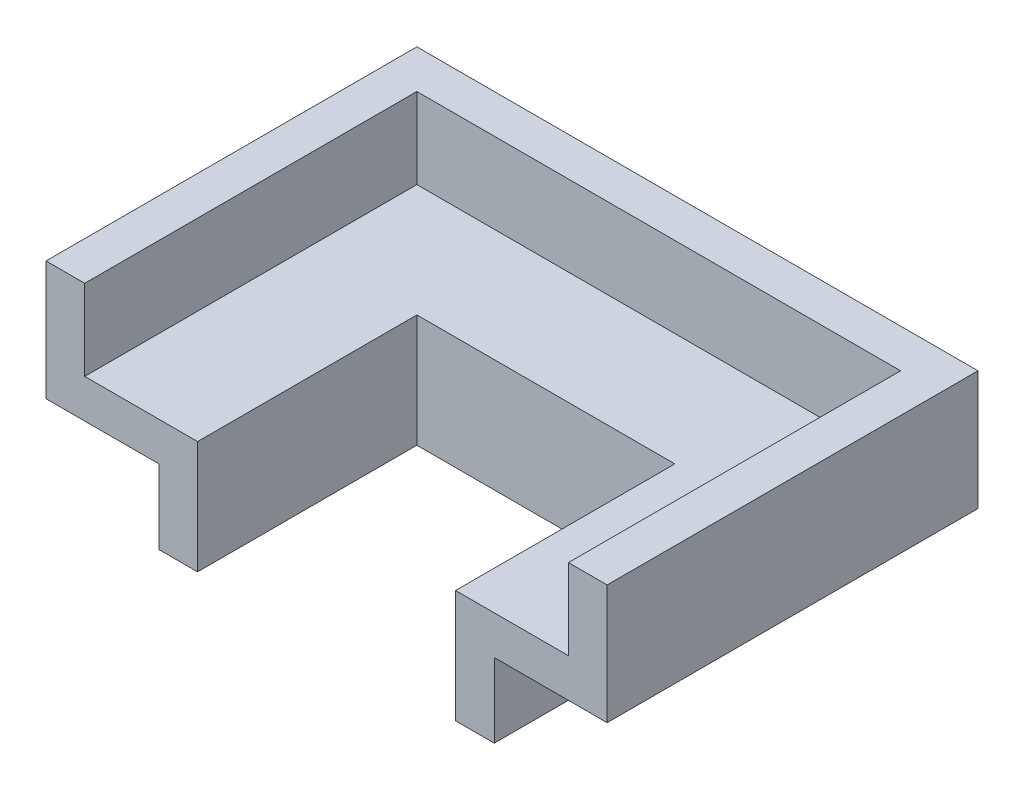
ISO-10303-21;
HEADER;
FILE_DESCRIPTION(('STEP AP214'),'2;1');
FILE_NAME('part.step','',(''),(''),'','','');
FILE_SCHEMA(('AUTOMOTIVE_DESIGN { 1 0 10303 214 1 1 1 1 }'));
ENDSEC;
DATA;
#1=APPLICATION_CONTEXT('core data for automotive mechanical design processes');
#2=APPLICATION_PROTOCOL_DEFINITION('international standard','automotive_design',2000,#1);
#3=PRODUCT_CONTEXT('',#1,'mechanical');
#4=PRODUCT('Part','Part','',(#3));
#5=PRODUCT_RELATED_PRODUCT_CATEGORY('part','',(#4));
#6=PRODUCT_DEFINITION_FORMATION('','',#4);
#7=PRODUCT_DEFINITION_CONTEXT('part definition',#1,'design');
#8=PRODUCT_DEFINITION('design','',#6,#7);
#9=PRODUCT_DEFINITION_SHAPE('','',#8);
#10=(LENGTH_UNIT() NAMED_UNIT(*) SI_UNIT(.MILLI.,.METRE.));
#11=(NAMED_UNIT(*) PLANE_ANGLE_UNIT() SI_UNIT($,.RADIAN.));
#12=(NAMED_UNIT(*) SI_UNIT($,.STERADIAN.) SOLID_ANGLE_UNIT());
#13=UNCERTAINTY_MEASURE_WITH_UNIT(LENGTH_MEASURE(1.E-05),#10,'distance_accuracy_value','');
#14=(GEOMETRIC_REPRESENTATION_CONTEXT(3) GLOBAL_UNCERTAINTY_ASSIGNED_CONTEXT((#13)) GLOBAL_UNIT_ASSIGNED_CONTEXT((#10,
#11,#12)) REPRESENTATION_CONTEXT('',''));
#15=CARTESIAN_POINT('',(0.,0.,0.));
#16=DIRECTION('',(0.,0.,1.));
#17=DIRECTION('',(1.,0.,0.));
#18=AXIS2_PLACEMENT_3D('',#15,#16,#17);
#19=CARTESIAN_POINT('',(-40.,0.,-68.));
#20=DIRECTION('',(1.,0.,0.));
#21=DIRECTION('',(0.,0.,-1.));
#22=AXIS2_PLACEMENT_3D('',#19,#20,#21);
#23=PLANE('',#22);
#24=DIRECTION('',(0.,0.,1.));
#25=VECTOR('',#24,1.);
#26=CARTESIAN_POINT('',(-40.,35.,-68.));
#27=LINE('',#26,#25);
#28=CARTESIAN_POINT('',(-40.,35.,-68.));
#29=VERTEX_POINT('',#28);
#30=CARTESIAN_POINT('',(-40.,35.,0.));
#31=VERTEX_POINT('',#30);
#32=EDGE_CURVE('E229',#29,#31,#27,.T.);
#33=ORIENTED_EDGE('',*,*,#32,.T.);
#34=DIRECTION('',(0.,-1.,0.));
#35=VECTOR('',#34,1.);
#36=CARTESIAN_POINT('',(-40.,0.,0.));
#37=LINE('',#36,#35);
#38=CARTESIAN_POINT('',(-39.9999999999999,0.,0.));
#39=VERTEX_POINT('',#38);
#40=EDGE_CURVE('E255',#31,#39,#37,.T.);
#41=ORIENTED_EDGE('',*,*,#40,.T.);
#42=DIRECTION('',(0.,0.,1.));
#43=VECTOR('',#42,1.);
#44=CARTESIAN_POINT('',(-40.,0.,-68.));
#45=LINE('',#44,#43);
#46=CARTESIAN_POINT('',(-40.,0.,-68.));
#47=VERTEX_POINT('',#46);
#48=EDGE_CURVE('E233',#47,#39,#45,.T.);
#49=ORIENTED_EDGE('',*,*,#48,.F.);
#50=DIRECTION('',(0.,1.,0.));
#51=VECTOR('',#50,1.);
#52=CARTESIAN_POINT('',(-40.,0.,-68.));
#53=LINE('',#52,#51);
#54=EDGE_CURVE('E230',#47,#29,#53,.T.);
#55=ORIENTED_EDGE('',*,*,#54,.T.);
#56=EDGE_LOOP('',(#33,#41,#49,#55));
#57=FACE_BOUND('',#56,.T.);
#58=ADVANCED_FACE('F34',(#57),#23,.T.);
#59=CARTESIAN_POINT('',(-52.,0.,-80.));
#60=DIRECTION('',(-1.,0.,0.));
#61=DIRECTION('',(0.,0.,1.));
#62=AXIS2_PLACEMENT_3D('',#59,#60,#61);
#63=PLANE('',#62);
#64=DIRECTION('',(0.,0.,1.));
#65=VECTOR('',#64,1.);
#66=CARTESIAN_POINT('',(-52.,0.,-80.));
#67=LINE('',#66,#65);
#68=CARTESIAN_POINT('',(-52.,0.,-80.));
#69=VERTEX_POINT('',#68);
#70=CARTESIAN_POINT('',(-52.,0.,0.));
#71=VERTEX_POINT('',#70);
#72=EDGE_CURVE('E236',#69,#71,#67,.T.);
#73=ORIENTED_EDGE('',*,*,#72,.T.);
#74=DIRECTION('',(0.,1.,0.));
#75=VECTOR('',#74,1.);
#76=CARTESIAN_POINT('',(-52.,0.,0.));
#77=LINE('',#76,#75);
#78=CARTESIAN_POINT('',(-52.,23.,0.));
#79=VERTEX_POINT('',#78);
#80=EDGE_CURVE('E289',#71,#79,#77,.T.);
#81=ORIENTED_EDGE('',*,*,#80,.T.);
#82=DIRECTION('',(0.,0.,1.));
#83=VECTOR('',#82,1.);
#84=CARTESIAN_POINT('',(-52.,23.,-80.));
#85=LINE('',#84,#83);
#86=CARTESIAN_POINT('',(-52.,23.,-80.));
#87=VERTEX_POINT('',#86);
#88=EDGE_CURVE('E239',#87,#79,#85,.T.);
#89=ORIENTED_EDGE('',*,*,#88,.F.);
#90=DIRECTION('',(0.,-1.,0.));
#91=VECTOR('',#90,1.);
#92=CARTESIAN_POINT('',(-52.,0.,-80.));
#93=LINE('',#92,#91);
#94=EDGE_CURVE('E264',#87,#69,#93,.T.);
#95=ORIENTED_EDGE('',*,*,#94,.T.);
#96=EDGE_LOOP('',(#73,#81,#89,#95));
#97=FACE_BOUND('',#96,.T.);
#98=ADVANCED_FACE('F303',(#97),#63,.T.);
#99=CARTESIAN_POINT('',(-87.,23.,-115.));
#100=DIRECTION('',(-1.,0.,0.));
#101=DIRECTION('',(0.,0.,1.));
#102=AXIS2_PLACEMENT_3D('',#99,#100,#101);
#103=PLANE('',#102);
#104=DIRECTION('',(0.,0.,1.));
#105=VECTOR('',#104,1.);
#106=CARTESIAN_POINT('',(-87.,23.,-115.));
#107=LINE('',#106,#105);
#108=CARTESIAN_POINT('',(-87.,23.,-115.));
#109=VERTEX_POINT('',#108);
#110=CARTESIAN_POINT('',(-87.,23.,0.));
#111=VERTEX_POINT('',#110);
#112=EDGE_CURVE('E242',#109,#111,#107,.T.);
#113=ORIENTED_EDGE('',*,*,#112,.T.);
#114=DIRECTION('',(0.,1.,0.));
#115=VECTOR('',#114,1.);
#116=CARTESIAN_POINT('',(-87.,23.,0.));
#117=LINE('',#116,#115);
#118=CARTESIAN_POINT('',(-87.0000000000001,60.,0.));
#119=VERTEX_POINT('',#118);
#120=EDGE_CURVE('E43',#111,#119,#117,.T.);
#121=ORIENTED_EDGE('',*,*,#120,.T.);
#122=DIRECTION('',(0.,0.,1.));
#123=VECTOR('',#122,1.);
#124=CARTESIAN_POINT('',(-87.0000000000001,60.,-115.));
#125=LINE('',#124,#123);
#126=CARTESIAN_POINT('',(-87.0000000000001,60.,-115.));
#127=VERTEX_POINT('',#126);
#128=EDGE_CURVE('E245',#127,#119,#125,.T.);
#129=ORIENTED_EDGE('',*,*,#128,.F.);
#130=DIRECTION('',(0.,-1.,0.));
#131=VECTOR('',#130,1.);
#132=CARTESIAN_POINT('',(-87.,23.,-115.));
#133=LINE('',#132,#131);
#134=EDGE_CURVE('E225',#127,#109,#133,.T.);
#135=ORIENTED_EDGE('',*,*,#134,.T.);
#136=EDGE_LOOP('',(#113,#121,#129,#135));
#137=FACE_BOUND('',#136,.T.);
#138=ADVANCED_FACE('F297',(#137),#103,.T.);
#139=CARTESIAN_POINT('',(-75.,35.,-103.));
#140=DIRECTION('',(1.,0.,0.));
#141=DIRECTION('',(0.,0.,-1.));
#142=AXIS2_PLACEMENT_3D('',#139,#140,#141);
#143=PLANE('',#142);
#144=DIRECTION('',(0.,0.,1.));
#145=VECTOR('',#144,1.);
#146=CARTESIAN_POINT('',(-75.,60.,-103.));
#147=LINE('',#146,#145);
#148=CARTESIAN_POINT('',(-75.,60.,-103.));
#149=VERTEX_POINT('',#148);
#150=CARTESIAN_POINT('',(-75.,60.,0.));
#151=VERTEX_POINT('',#150);
#152=EDGE_CURVE('E247',#149,#151,#147,.T.);
#153=ORIENTED_EDGE('',*,*,#152,.T.);
#154=DIRECTION('',(0.,-1.,0.));
#155=VECTOR('',#154,1.);
#156=CARTESIAN_POINT('',(-75.,35.,0.));
#157=LINE('',#156,#155);
#158=CARTESIAN_POINT('',(-75.,35.,0.));
#159=VERTEX_POINT('',#158);
#160=EDGE_CURVE('E38',#151,#159,#157,.T.);
#161=ORIENTED_EDGE('',*,*,#160,.T.);
#162=DIRECTION('',(0.,0.,1.));
#163=VECTOR('',#162,1.);
#164=CARTESIAN_POINT('',(-75.,35.,-103.));
#165=LINE('',#164,#163);
#166=CARTESIAN_POINT('',(-75.,35.,-103.));
#167=VERTEX_POINT('',#166);
#168=EDGE_CURVE('E249',#167,#159,#165,.T.);
#169=ORIENTED_EDGE('',*,*,#168,.F.);
#170=DIRECTION('',(0.,1.,0.));
#171=VECTOR('',#170,1.);
#172=CARTESIAN_POINT('',(-75.,35.,-103.));
#173=LINE('',#172,#171);
#174=EDGE_CURVE('E226',#167,#149,#173,.T.);
#175=ORIENTED_EDGE('',*,*,#174,.T.);
#176=EDGE_LOOP('',(#153,#161,#169,#175));
#177=FACE_BOUND('',#176,.T.);
#178=ADVANCED_FACE('F36',(#177),#143,.T.);
#179=CARTESIAN_POINT('',(40.,0.,-68.));
#180=DIRECTION('',(0.,0.,-1.));
#181=DIRECTION('',(-1.,0.,0.));
#182=AXIS2_PLACEMENT_3D('',#179,#180,#181);
#183=PLANE('',#182);
#184=ORIENTED_EDGE('',*,*,#54,.F.);
#185=DIRECTION('',(-1.,0.,0.));
#186=VECTOR('',#185,1.);
#187=CARTESIAN_POINT('',(40.,0.,-68.));
#188=LINE('',#187,#186);
#189=CARTESIAN_POINT('',(40.,0.,-68.));
#190=VERTEX_POINT('',#189);
#191=EDGE_CURVE('E206',#190,#47,#188,.T.);
#192=ORIENTED_EDGE('',*,*,#191,.F.);
#193=DIRECTION('',(0.,-1.,0.));
#194=VECTOR('',#193,1.);
#195=CARTESIAN_POINT('',(40.,0.,-68.));
#196=LINE('',#195,#194);
#197=CARTESIAN_POINT('',(40.,35.,-68.));
#198=VERTEX_POINT('',#197);
#199=EDGE_CURVE('E173',#198,#190,#196,.T.);
#200=ORIENTED_EDGE('',*,*,#199,.F.);
#201=DIRECTION('',(-1.,0.,0.));
#202=VECTOR('',#201,1.);
#203=CARTESIAN_POINT('',(40.,35.,-68.));
#204=LINE('',#203,#202);
#205=EDGE_CURVE('E203',#198,#29,#204,.T.);
#206=ORIENTED_EDGE('',*,*,#205,.T.);
#207=EDGE_LOOP('',(#184,#192,#200,#206));
#208=FACE_BOUND('',#207,.T.);
#209=ADVANCED_FACE('F285',(#208),#183,.F.);
#210=CARTESIAN_POINT('',(52.,0.,-80.));
#211=DIRECTION('',(0.,0.,1.));
#212=DIRECTION('',(1.,0.,0.));
#213=AXIS2_PLACEMENT_3D('',#210,#211,#212);
#214=PLANE('',#213);
#215=ORIENTED_EDGE('',*,*,#94,.F.);
#216=DIRECTION('',(-1.,0.,0.));
#217=VECTOR('',#216,1.);
#218=CARTESIAN_POINT('',(52.,23.,-80.));
#219=LINE('',#218,#217);
#220=CARTESIAN_POINT('',(52.,23.,-80.));
#221=VERTEX_POINT('',#220);
#222=EDGE_CURVE('E210',#221,#87,#219,.T.);
#223=ORIENTED_EDGE('',*,*,#222,.F.);
#224=DIRECTION('',(0.,1.,0.));
#225=VECTOR('',#224,1.);
#226=CARTESIAN_POINT('',(52.,0.,-80.));
#227=LINE('',#226,#225);
#228=CARTESIAN_POINT('',(52.,0.,-80.));
#229=VERTEX_POINT('',#228);
#230=EDGE_CURVE('E191',#229,#221,#227,.T.);
#231=ORIENTED_EDGE('',*,*,#230,.F.);
#232=DIRECTION('',(-1.,0.,0.));
#233=VECTOR('',#232,1.);
#234=CARTESIAN_POINT('',(52.,0.,-80.));
#235=LINE('',#234,#233);
#236=EDGE_CURVE('E152',#229,#69,#235,.T.);
#237=ORIENTED_EDGE('',*,*,#236,.T.);
#238=EDGE_LOOP('',(#215,#223,#231,#237));
#239=FACE_BOUND('',#238,.T.);
#240=ADVANCED_FACE('F305',(#239),#214,.F.);
#241=CARTESIAN_POINT('',(87.,23.,-115.));
#242=DIRECTION('',(0.,0.,1.));
#243=DIRECTION('',(1.,0.,0.));
#244=AXIS2_PLACEMENT_3D('',#241,#242,#243);
#245=PLANE('',#244);
#246=ORIENTED_EDGE('',*,*,#134,.F.);
#247=DIRECTION('',(-1.,0.,0.));
#248=VECTOR('',#247,1.);
#249=CARTESIAN_POINT('',(87.,60.,-115.));
#250=LINE('',#249,#248);
#251=CARTESIAN_POINT('',(87.,60.,-115.));
#252=VERTEX_POINT('',#251);
#253=EDGE_CURVE('E216',#252,#127,#250,.T.);
#254=ORIENTED_EDGE('',*,*,#253,.F.);
#255=DIRECTION('',(0.,1.,0.));
#256=VECTOR('',#255,1.);
#257=CARTESIAN_POINT('',(87.,23.,-115.));
#258=LINE('',#257,#256);
#259=CARTESIAN_POINT('',(87.,23.,-115.));
#260=VERTEX_POINT('',#259);
#261=EDGE_CURVE('E270',#260,#252,#258,.T.);
#262=ORIENTED_EDGE('',*,*,#261,.F.);
#263=DIRECTION('',(-1.,0.,0.));
#264=VECTOR('',#263,1.);
#265=CARTESIAN_POINT('',(87.,23.,-115.));
#266=LINE('',#265,#264);
#267=EDGE_CURVE('E213',#260,#109,#266,.T.);
#268=ORIENTED_EDGE('',*,*,#267,.T.);
#269=EDGE_LOOP('',(#246,#254,#262,#268));
#270=FACE_BOUND('',#269,.T.);
#271=ADVANCED_FACE('F324',(#270),#245,.F.);
#272=CARTESIAN_POINT('',(75.,35.,-103.));
#273=DIRECTION('',(0.,0.,-1.));
#274=DIRECTION('',(-1.,0.,0.));
#275=AXIS2_PLACEMENT_3D('',#272,#273,#274);
#276=PLANE('',#275);
#277=ORIENTED_EDGE('',*,*,#174,.F.);
#278=DIRECTION('',(-1.,0.,0.));
#279=VECTOR('',#278,1.);
#280=CARTESIAN_POINT('',(75.,35.,-103.));
#281=LINE('',#280,#279);
#282=CARTESIAN_POINT('',(75.,35.,-103.));
#283=VERTEX_POINT('',#282);
#284=EDGE_CURVE('E222',#283,#167,#281,.T.);
#285=ORIENTED_EDGE('',*,*,#284,.F.);
#286=DIRECTION('',(0.,-1.,0.));
#287=VECTOR('',#286,1.);
#288=CARTESIAN_POINT('',(75.,35.,-103.));
#289=LINE('',#288,#287);
#290=CARTESIAN_POINT('',(75.,60.,-103.));
#291=VERTEX_POINT('',#290);
#292=EDGE_CURVE('E272',#291,#283,#289,.T.);
#293=ORIENTED_EDGE('',*,*,#292,.F.);
#294=DIRECTION('',(-1.,0.,0.));
#295=VECTOR('',#294,1.);
#296=CARTESIAN_POINT('',(75.,60.,-103.));
#297=LINE('',#296,#295);
#298=EDGE_CURVE('E219',#291,#149,#297,.T.);
#299=ORIENTED_EDGE('',*,*,#298,.T.);
#300=EDGE_LOOP('',(#277,#285,#293,#299));
#301=FACE_BOUND('',#300,.T.);
#302=ADVANCED_FACE('F322',(#301),#276,.F.);
#303=CARTESIAN_POINT('',(0.,0.,0.));
#304=DIRECTION('',(0.,0.,1.));
#305=DIRECTION('',(1.,0.,0.));
#306=AXIS2_PLACEMENT_3D('',#303,#304,#305);
#307=PLANE('',#306);
#308=DIRECTION('',(1.,0.,0.));
#309=VECTOR('',#308,1.);
#310=CARTESIAN_POINT('',(40.,0.,0.));
#311=LINE('',#310,#309);
#312=CARTESIAN_POINT('',(40.,0.,0.));
#313=VERTEX_POINT('',#312);
#314=CARTESIAN_POINT('',(52.,0.,0.));
#315=VERTEX_POINT('',#314);
#316=EDGE_CURVE('E149',#313,#315,#311,.T.);
#317=ORIENTED_EDGE('',*,*,#316,.T.);
#318=DIRECTION('',(0.,1.,0.));
#319=VECTOR('',#318,1.);
#320=CARTESIAN_POINT('',(52.,0.,0.));
#321=LINE('',#320,#319);
#322=CARTESIAN_POINT('',(52.,23.,0.));
#323=VERTEX_POINT('',#322);
#324=EDGE_CURVE('E160',#315,#323,#321,.T.);
#325=ORIENTED_EDGE('',*,*,#324,.T.);
#326=DIRECTION('',(1.,0.,0.));
#327=VECTOR('',#326,1.);
#328=CARTESIAN_POINT('',(52.,23.,0.));
#329=LINE('',#328,#327);
#330=CARTESIAN_POINT('',(87.,23.,0.));
#331=VERTEX_POINT('',#330);
#332=EDGE_CURVE('E166',#323,#331,#329,.T.);
#333=ORIENTED_EDGE('',*,*,#332,.T.);
#334=DIRECTION('',(0.,1.,0.));
#335=VECTOR('',#334,1.);
#336=CARTESIAN_POINT('',(87.,23.,0.));
#337=LINE('',#336,#335);
#338=CARTESIAN_POINT('',(87.,60.,0.));
#339=VERTEX_POINT('',#338);
#340=EDGE_CURVE('E177',#331,#339,#337,.T.);
#341=ORIENTED_EDGE('',*,*,#340,.T.);
#342=DIRECTION('',(-1.,0.,0.));
#343=VECTOR('',#342,1.);
#344=CARTESIAN_POINT('',(75.,60.,0.));
#345=LINE('',#344,#343);
#346=CARTESIAN_POINT('',(75.,60.,0.));
#347=VERTEX_POINT('',#346);
#348=EDGE_CURVE('E180',#339,#347,#345,.T.);
#349=ORIENTED_EDGE('',*,*,#348,.T.);
#350=DIRECTION('',(0.,-1.,0.));
#351=VECTOR('',#350,1.);
#352=CARTESIAN_POINT('',(75.,35.,0.));
#353=LINE('',#352,#351);
#354=CARTESIAN_POINT('',(75.,35.,0.));
#355=VERTEX_POINT('',#354);
#356=EDGE_CURVE('E183',#347,#355,#353,.T.);
#357=ORIENTED_EDGE('',*,*,#356,.T.);
#358=DIRECTION('',(-1.,0.,0.));
#359=VECTOR('',#358,1.);
#360=CARTESIAN_POINT('',(40.,35.,0.));
#361=LINE('',#360,#359);
#362=CARTESIAN_POINT('',(40.,35.,0.));
#363=VERTEX_POINT('',#362);
#364=EDGE_CURVE('E186',#355,#363,#361,.T.);
#365=ORIENTED_EDGE('',*,*,#364,.T.);
#366=DIRECTION('',(0.,-1.,0.));
#367=VECTOR('',#366,1.);
#368=CARTESIAN_POINT('',(40.,0.,0.));
#369=LINE('',#368,#367);
#370=EDGE_CURVE('E157',#363,#313,#369,.T.);
#371=ORIENTED_EDGE('',*,*,#370,.T.);
#372=EDGE_LOOP('',(#317,#325,#333,#341,#349,#357,#365,#371));
#373=FACE_BOUND('',#372,.T.);
#374=ADVANCED_FACE('F168',(#373),#307,.T.);
#375=CARTESIAN_POINT('',(40.,0.,-167.716796049165));
#376=DIRECTION('',(0.,-1.,0.));
#377=DIRECTION('',(0.,0.,-1.));
#378=AXIS2_PLACEMENT_3D('',#375,#376,#377);
#379=PLANE('',#378);
#380=DIRECTION('',(0.,0.,1.));
#381=VECTOR('',#380,1.);
#382=CARTESIAN_POINT('',(40.,0.,-167.716796049165));
#383=LINE('',#382,#381);
#384=EDGE_CURVE('E189',#190,#313,#383,.T.);
#385=ORIENTED_EDGE('',*,*,#384,.F.);
#386=ORIENTED_EDGE('',*,*,#191,.T.);
#387=ORIENTED_EDGE('',*,*,#48,.T.);
#388=DIRECTION('',(-1.,0.,0.));
#389=VECTOR('',#388,1.);
#390=CARTESIAN_POINT('',(0.,0.,0.));
#391=LINE('',#390,#389);
#392=EDGE_CURVE('E258',#39,#71,#391,.T.);
#393=ORIENTED_EDGE('',*,*,#392,.T.);
#394=ORIENTED_EDGE('',*,*,#72,.F.);
#395=ORIENTED_EDGE('',*,*,#236,.F.);
#396=DIRECTION('',(0.,0.,1.));
#397=VECTOR('',#396,1.);
#398=CARTESIAN_POINT('',(52.,0.,-167.716796049165));
#399=LINE('',#398,#397);
#400=EDGE_CURVE('E144',#229,#315,#399,.T.);
#401=ORIENTED_EDGE('',*,*,#400,.T.);
#402=ORIENTED_EDGE('',*,*,#316,.F.);
#403=EDGE_LOOP('',(#385,#386,#387,#393,#394,#395,#401,#402));
#404=FACE_BOUND('',#403,.T.);
#405=ADVANCED_FACE('F147',(#404),#379,.T.);
#406=CARTESIAN_POINT('',(52.,0.,-167.716796049165));
#407=DIRECTION('',(1.,0.,0.));
#408=DIRECTION('',(0.,0.,-1.));
#409=AXIS2_PLACEMENT_3D('',#406,#407,#408);
#410=PLANE('',#409);
#411=ORIENTED_EDGE('',*,*,#400,.F.);
#412=ORIENTED_EDGE('',*,*,#230,.T.);
#413=DIRECTION('',(0.,0.,1.));
#414=VECTOR('',#413,1.);
#415=CARTESIAN_POINT('',(52.,23.,-167.716796049165));
#416=LINE('',#415,#414);
#417=EDGE_CURVE('E156',#221,#323,#416,.T.);
#418=ORIENTED_EDGE('',*,*,#417,.T.);
#419=ORIENTED_EDGE('',*,*,#324,.F.);
#420=EDGE_LOOP('',(#411,#412,#418,#419));
#421=FACE_BOUND('',#420,.T.);
#422=ADVANCED_FACE('F161',(#421),#410,.T.);
#423=CARTESIAN_POINT('',(52.,23.,-167.716796049165));
#424=DIRECTION('',(0.,-1.,0.));
#425=DIRECTION('',(0.,0.,-1.));
#426=AXIS2_PLACEMENT_3D('',#423,#424,#425);
#427=PLANE('',#426);
#428=ORIENTED_EDGE('',*,*,#417,.F.);
#429=ORIENTED_EDGE('',*,*,#222,.T.);
#430=ORIENTED_EDGE('',*,*,#88,.T.);
#431=DIRECTION('',(-1.,0.,0.));
#432=VECTOR('',#431,1.);
#433=CARTESIAN_POINT('',(0.,23.,0.));
#434=LINE('',#433,#432);
#435=EDGE_CURVE('E290',#79,#111,#434,.T.);
#436=ORIENTED_EDGE('',*,*,#435,.T.);
#437=ORIENTED_EDGE('',*,*,#112,.F.);
#438=ORIENTED_EDGE('',*,*,#267,.F.);
#439=DIRECTION('',(0.,0.,1.));
#440=VECTOR('',#439,1.);
#441=CARTESIAN_POINT('',(87.,23.,-167.716796049165));
#442=LINE('',#441,#440);
#443=EDGE_CURVE('E200',#260,#331,#442,.T.);
#444=ORIENTED_EDGE('',*,*,#443,.T.);
#445=ORIENTED_EDGE('',*,*,#332,.F.);
#446=EDGE_LOOP('',(#428,#429,#430,#436,#437,#438,#444,#445));
#447=FACE_BOUND('',#446,.T.);
#448=ADVANCED_FACE('F300',(#447),#427,.T.);
#449=CARTESIAN_POINT('',(87.,23.,-167.716796049165));
#450=DIRECTION('',(1.,0.,0.));
#451=DIRECTION('',(0.,0.,-1.));
#452=AXIS2_PLACEMENT_3D('',#449,#450,#451);
#453=PLANE('',#452);
#454=ORIENTED_EDGE('',*,*,#443,.F.);
#455=ORIENTED_EDGE('',*,*,#261,.T.);
#456=DIRECTION('',(0.,0.,1.));
#457=VECTOR('',#456,1.);
#458=CARTESIAN_POINT('',(87.,60.,-167.716796049165));
#459=LINE('',#458,#457);
#460=EDGE_CURVE('E198',#252,#339,#459,.T.);
#461=ORIENTED_EDGE('',*,*,#460,.T.);
#462=ORIENTED_EDGE('',*,*,#340,.F.);
#463=EDGE_LOOP('',(#454,#455,#461,#462));
#464=FACE_BOUND('',#463,.T.);
#465=ADVANCED_FACE('F310',(#464),#453,.T.);
#466=CARTESIAN_POINT('',(75.,60.,-167.716796049165));
#467=DIRECTION('',(0.,1.,0.));
#468=DIRECTION('',(0.,0.,1.));
#469=AXIS2_PLACEMENT_3D('',#466,#467,#468);
#470=PLANE('',#469);
#471=ORIENTED_EDGE('',*,*,#460,.F.);
#472=ORIENTED_EDGE('',*,*,#253,.T.);
#473=ORIENTED_EDGE('',*,*,#128,.T.);
#474=DIRECTION('',(1.,0.,0.));
#475=VECTOR('',#474,1.);
#476=CARTESIAN_POINT('',(0.,60.,0.));
#477=LINE('',#476,#475);
#478=EDGE_CURVE('E12',#119,#151,#477,.T.);
#479=ORIENTED_EDGE('',*,*,#478,.T.);
#480=ORIENTED_EDGE('',*,*,#152,.F.);
#481=ORIENTED_EDGE('',*,*,#298,.F.);
#482=DIRECTION('',(0.,0.,1.));
#483=VECTOR('',#482,1.);
#484=CARTESIAN_POINT('',(75.,60.,-167.716796049165));
#485=LINE('',#484,#483);
#486=EDGE_CURVE('E196',#291,#347,#485,.T.);
#487=ORIENTED_EDGE('',*,*,#486,.T.);
#488=ORIENTED_EDGE('',*,*,#348,.F.);
#489=EDGE_LOOP('',(#471,#472,#473,#479,#480,#481,#487,#488));
#490=FACE_BOUND('',#489,.T.);
#491=ADVANCED_FACE('F314',(#490),#470,.T.);
#492=CARTESIAN_POINT('',(75.,35.,-167.716796049165));
#493=DIRECTION('',(-1.,0.,0.));
#494=DIRECTION('',(0.,0.,1.));
#495=AXIS2_PLACEMENT_3D('',#492,#493,#494);
#496=PLANE('',#495);
#497=ORIENTED_EDGE('',*,*,#486,.F.);
#498=ORIENTED_EDGE('',*,*,#292,.T.);
#499=DIRECTION('',(0.,0.,1.));
#500=VECTOR('',#499,1.);
#501=CARTESIAN_POINT('',(75.,35.,-167.716796049165));
#502=LINE('',#501,#500);
#503=EDGE_CURVE('E194',#283,#355,#502,.T.);
#504=ORIENTED_EDGE('',*,*,#503,.T.);
#505=ORIENTED_EDGE('',*,*,#356,.F.);
#506=EDGE_LOOP('',(#497,#498,#504,#505));
#507=FACE_BOUND('',#506,.T.);
#508=ADVANCED_FACE('F316',(#507),#496,.T.);
#509=CARTESIAN_POINT('',(40.,35.,-167.716796049165));
#510=DIRECTION('',(0.,1.,0.));
#511=DIRECTION('',(0.,0.,1.));
#512=AXIS2_PLACEMENT_3D('',#509,#510,#511);
#513=PLANE('',#512);
#514=ORIENTED_EDGE('',*,*,#503,.F.);
#515=ORIENTED_EDGE('',*,*,#284,.T.);
#516=ORIENTED_EDGE('',*,*,#168,.T.);
#517=DIRECTION('',(1.,0.,0.));
#518=VECTOR('',#517,1.);
#519=CARTESIAN_POINT('',(0.,35.,0.));
#520=LINE('',#519,#518);
#521=EDGE_CURVE('E253',#159,#31,#520,.T.);
#522=ORIENTED_EDGE('',*,*,#521,.T.);
#523=ORIENTED_EDGE('',*,*,#32,.F.);
#524=ORIENTED_EDGE('',*,*,#205,.F.);
#525=DIRECTION('',(0.,0.,1.));
#526=VECTOR('',#525,1.);
#527=CARTESIAN_POINT('',(40.,35.,-167.716796049165));
#528=LINE('',#527,#526);
#529=EDGE_CURVE('E192',#198,#363,#528,.T.);
#530=ORIENTED_EDGE('',*,*,#529,.T.);
#531=ORIENTED_EDGE('',*,*,#364,.F.);
#532=EDGE_LOOP('',(#514,#515,#516,#522,#523,#524,#530,#531));
#533=FACE_BOUND('',#532,.T.);
#534=ADVANCED_FACE('F319',(#533),#513,.T.);
#535=CARTESIAN_POINT('',(40.,0.,-167.716796049165));
#536=DIRECTION('',(-1.,0.,0.));
#537=DIRECTION('',(0.,0.,1.));
#538=AXIS2_PLACEMENT_3D('',#535,#536,#537);
#539=PLANE('',#538);
#540=ORIENTED_EDGE('',*,*,#529,.F.);
#541=ORIENTED_EDGE('',*,*,#199,.T.);
#542=ORIENTED_EDGE('',*,*,#384,.T.);
#543=ORIENTED_EDGE('',*,*,#370,.F.);
#544=EDGE_LOOP('',(#540,#541,#542,#543));
#545=FACE_BOUND('',#544,.T.);
#546=ADVANCED_FACE('F281',(#545),#539,.T.);
#547=CARTESIAN_POINT('',(-63.5,30.,0.));
#548=DIRECTION('',(0.,0.,1.));
#549=DIRECTION('',(1.,0.,0.));
#550=AXIS2_PLACEMENT_3D('',#547,#548,#549);
#551=PLANE('',#550);
#552=ORIENTED_EDGE('',*,*,#160,.F.);
#553=ORIENTED_EDGE('',*,*,#478,.F.);
#554=ORIENTED_EDGE('',*,*,#120,.F.);
#555=ORIENTED_EDGE('',*,*,#435,.F.);
#556=ORIENTED_EDGE('',*,*,#80,.F.);
#557=ORIENTED_EDGE('',*,*,#392,.F.);
#558=ORIENTED_EDGE('',*,*,#40,.F.);
#559=ORIENTED_EDGE('',*,*,#521,.F.);
#560=EDGE_LOOP('',(#552,#553,#554,#555,#556,#557,#558,#559));
#561=FACE_BOUND('',#560,.T.);
#562=ADVANCED_FACE('F287',(#561),#551,.T.);
#563=CLOSED_SHELL('',(#58,#98,#138,#178,#209,#240,#271,#302,#374,#405,#422,#448,#465,#491,#508,
#534,#546,#562));
#564=MANIFOLD_SOLID_BREP('B2',#563);
#565=ADVANCED_BREP_SHAPE_REPRESENTATION('',(#18,#564),#14);
#566=SHAPE_DEFINITION_REPRESENTATION(#9,#565);
ENDSEC;
END-ISO-10303-21;
